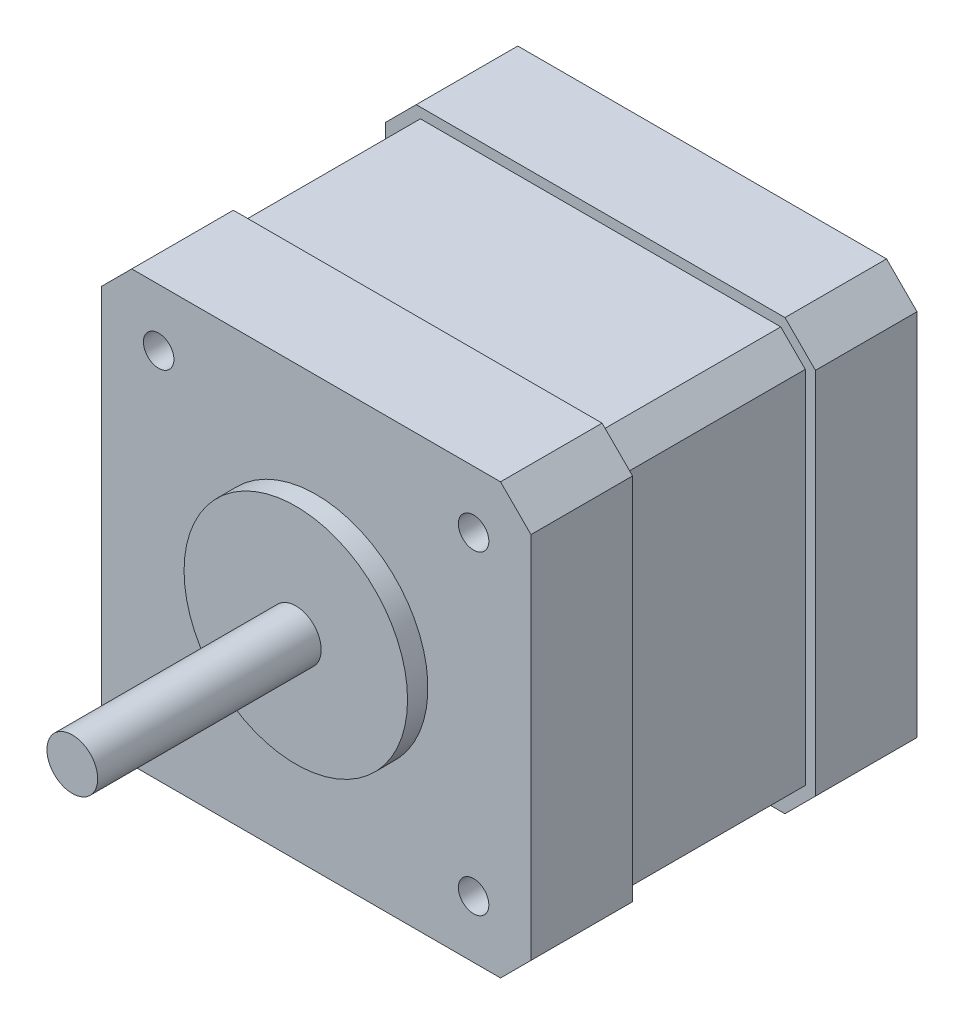
ISO-10303-21;
HEADER;
FILE_DESCRIPTION(('STEP AP214'),'2;1');
FILE_NAME('part.step','',(''),(''),'','','');
FILE_SCHEMA(('AUTOMOTIVE_DESIGN { 1 0 10303 214 1 1 1 1 }'));
ENDSEC;
DATA;
#1=APPLICATION_CONTEXT('core data for automotive mechanical design processes');
#2=APPLICATION_PROTOCOL_DEFINITION('international standard','automotive_design',2000,#1);
#3=PRODUCT_CONTEXT('',#1,'mechanical');
#4=PRODUCT('Part','Part','',(#3));
#5=PRODUCT_RELATED_PRODUCT_CATEGORY('part','',(#4));
#6=PRODUCT_DEFINITION_FORMATION('','',#4);
#7=PRODUCT_DEFINITION_CONTEXT('part definition',#1,'design');
#8=PRODUCT_DEFINITION('design','',#6,#7);
#9=PRODUCT_DEFINITION_SHAPE('','',#8);
#10=(LENGTH_UNIT() NAMED_UNIT(*) SI_UNIT(.MILLI.,.METRE.));
#11=(NAMED_UNIT(*) PLANE_ANGLE_UNIT() SI_UNIT($,.RADIAN.));
#12=(NAMED_UNIT(*) SI_UNIT($,.STERADIAN.) SOLID_ANGLE_UNIT());
#13=UNCERTAINTY_MEASURE_WITH_UNIT(LENGTH_MEASURE(1.E-05),#10,'distance_accuracy_value','');
#14=(GEOMETRIC_REPRESENTATION_CONTEXT(3) GLOBAL_UNCERTAINTY_ASSIGNED_CONTEXT((#13)) GLOBAL_UNIT_ASSIGNED_CONTEXT((#10,
#11,#12)) REPRESENTATION_CONTEXT('',''));
#15=CARTESIAN_POINT('',(0.,0.,0.));
#16=DIRECTION('',(0.,0.,1.));
#17=DIRECTION('',(1.,0.,0.));
#18=AXIS2_PLACEMENT_3D('',#15,#16,#17);
#19=CARTESIAN_POINT('',(0.,0.,0.));
#20=DIRECTION('',(0.,0.,-1.));
#21=DIRECTION('',(-1.,0.,0.));
#22=AXIS2_PLACEMENT_3D('',#19,#20,#21);
#23=PLANE('',#22);
#24=DIRECTION('',(-0.707106781186548,-0.707106781186548,0.));
#25=VECTOR('',#24,1.);
#26=CARTESIAN_POINT('',(-32.7677538051841,19.7638051044083,0.));
#27=LINE('',#26,#25);
#28=CARTESIAN_POINT('',(-29.7677538051841,22.7638051044083,0.));
#29=VERTEX_POINT('',#28);
#30=CARTESIAN_POINT('',(-32.7677538051841,19.7638051044083,0.));
#31=VERTEX_POINT('',#30);
#32=EDGE_CURVE('E158',#29,#31,#27,.T.);
#33=ORIENTED_EDGE('',*,*,#32,.F.);
#34=DIRECTION('',(-1.,0.,0.));
#35=VECTOR('',#34,1.);
#36=CARTESIAN_POINT('',(-29.7677538051841,22.7638051044083,0.));
#37=LINE('',#36,#35);
#38=CARTESIAN_POINT('',(6.53224619481587,22.7638051044083,0.));
#39=VERTEX_POINT('',#38);
#40=EDGE_CURVE('E98',#39,#29,#37,.T.);
#41=ORIENTED_EDGE('',*,*,#40,.F.);
#42=DIRECTION('',(-0.707106781186548,0.707106781186547,0.));
#43=VECTOR('',#42,1.);
#44=CARTESIAN_POINT('',(6.53224619481587,22.7638051044083,0.));
#45=LINE('',#44,#43);
#46=CARTESIAN_POINT('',(9.53224619481587,19.7638051044083,0.));
#47=VERTEX_POINT('',#46);
#48=EDGE_CURVE('E177',#47,#39,#45,.T.);
#49=ORIENTED_EDGE('',*,*,#48,.F.);
#50=DIRECTION('',(0.,1.,0.));
#51=VECTOR('',#50,1.);
#52=CARTESIAN_POINT('',(9.53224619481587,19.7638051044083,0.));
#53=LINE('',#52,#51);
#54=CARTESIAN_POINT('',(9.53224619481587,-16.5361948955916,0.));
#55=VERTEX_POINT('',#54);
#56=EDGE_CURVE('E141',#55,#47,#53,.T.);
#57=ORIENTED_EDGE('',*,*,#56,.F.);
#58=DIRECTION('',(0.707106781186548,0.707106781186547,0.));
#59=VECTOR('',#58,1.);
#60=CARTESIAN_POINT('',(9.53224619481587,-16.5361948955916,0.));
#61=LINE('',#60,#59);
#62=CARTESIAN_POINT('',(6.53224619481587,-19.5361948955916,0.));
#63=VERTEX_POINT('',#62);
#64=EDGE_CURVE('E172',#63,#55,#61,.T.);
#65=ORIENTED_EDGE('',*,*,#64,.F.);
#66=DIRECTION('',(1.,0.,0.));
#67=VECTOR('',#66,1.);
#68=CARTESIAN_POINT('',(6.53224619481587,-19.5361948955916,0.));
#69=LINE('',#68,#67);
#70=CARTESIAN_POINT('',(-29.7677538051841,-19.5361948955916,0.));
#71=VERTEX_POINT('',#70);
#72=EDGE_CURVE('E169',#71,#63,#69,.T.);
#73=ORIENTED_EDGE('',*,*,#72,.F.);
#74=DIRECTION('',(0.707106781186548,-0.707106781186548,0.));
#75=VECTOR('',#74,1.);
#76=CARTESIAN_POINT('',(-29.7677538051841,-19.5361948955916,0.));
#77=LINE('',#76,#75);
#78=CARTESIAN_POINT('',(-32.7677538051841,-16.5361948955916,0.));
#79=VERTEX_POINT('',#78);
#80=EDGE_CURVE('E166',#79,#71,#77,.T.);
#81=ORIENTED_EDGE('',*,*,#80,.F.);
#82=DIRECTION('',(0.,-1.,0.));
#83=VECTOR('',#82,1.);
#84=CARTESIAN_POINT('',(-32.7677538051841,-16.5361948955916,0.));
#85=LINE('',#84,#83);
#86=EDGE_CURVE('E162',#31,#79,#85,.T.);
#87=ORIENTED_EDGE('',*,*,#86,.F.);
#88=EDGE_LOOP('',(#33,#41,#49,#57,#65,#73,#81,#87));
#89=FACE_BOUND('',#88,.T.);
#90=DIRECTION('',(0.707106781186548,-0.707106781186547,0.));
#91=VECTOR('',#90,1.);
#92=CARTESIAN_POINT('',(8.53224619481587,19.3495915420353,0.));
#93=LINE('',#92,#91);
#94=CARTESIAN_POINT('',(6.11803263244278,21.7638051044083,0.));
#95=VERTEX_POINT('',#94);
#96=CARTESIAN_POINT('',(8.53224619481587,19.3495915420353,0.));
#97=VERTEX_POINT('',#96);
#98=EDGE_CURVE('E369',#95,#97,#93,.T.);
#99=ORIENTED_EDGE('',*,*,#98,.F.);
#100=DIRECTION('',(1.,0.,0.));
#101=VECTOR('',#100,1.);
#102=CARTESIAN_POINT('',(-11.6177538051841,21.7638051044083,0.));
#103=LINE('',#102,#101);
#104=CARTESIAN_POINT('',(-29.353540242811,21.7638051044083,0.));
#105=VERTEX_POINT('',#104);
#106=EDGE_CURVE('E305',#105,#95,#103,.T.);
#107=ORIENTED_EDGE('',*,*,#106,.F.);
#108=DIRECTION('',(0.707106781186547,0.707106781186547,0.));
#109=VECTOR('',#108,1.);
#110=CARTESIAN_POINT('',(-29.353540242811,21.7638051044083,0.));
#111=LINE('',#110,#109);
#112=CARTESIAN_POINT('',(-31.7677538051841,19.3495915420352,0.));
#113=VERTEX_POINT('',#112);
#114=EDGE_CURVE('E337',#113,#105,#111,.T.);
#115=ORIENTED_EDGE('',*,*,#114,.F.);
#116=DIRECTION('',(0.,1.,0.));
#117=VECTOR('',#116,1.);
#118=CARTESIAN_POINT('',(-31.7677538051841,-16.1219813332185,0.));
#119=LINE('',#118,#117);
#120=CARTESIAN_POINT('',(-31.7677538051841,-16.1219813332185,0.));
#121=VERTEX_POINT('',#120);
#122=EDGE_CURVE('E389',#121,#113,#119,.T.);
#123=ORIENTED_EDGE('',*,*,#122,.F.);
#124=DIRECTION('',(-0.707106781186549,0.707106781186547,0.));
#125=VECTOR('',#124,1.);
#126=CARTESIAN_POINT('',(-29.353540242811,-18.5361948955917,0.));
#127=LINE('',#126,#125);
#128=CARTESIAN_POINT('',(-29.353540242811,-18.5361948955917,0.));
#129=VERTEX_POINT('',#128);
#130=EDGE_CURVE('E385',#129,#121,#127,.T.);
#131=ORIENTED_EDGE('',*,*,#130,.F.);
#132=DIRECTION('',(-1.,0.,0.));
#133=VECTOR('',#132,1.);
#134=CARTESIAN_POINT('',(6.11803263244278,-18.5361948955916,0.));
#135=LINE('',#134,#133);
#136=CARTESIAN_POINT('',(6.11803263244278,-18.5361948955916,0.));
#137=VERTEX_POINT('',#136);
#138=EDGE_CURVE('E381',#137,#129,#135,.T.);
#139=ORIENTED_EDGE('',*,*,#138,.F.);
#140=DIRECTION('',(-0.707106781186547,-0.707106781186547,0.));
#141=VECTOR('',#140,1.);
#142=CARTESIAN_POINT('',(8.53224619481587,-16.1219813332186,0.));
#143=LINE('',#142,#141);
#144=CARTESIAN_POINT('',(8.53224619481587,-16.1219813332186,0.));
#145=VERTEX_POINT('',#144);
#146=EDGE_CURVE('E377',#145,#137,#143,.T.);
#147=ORIENTED_EDGE('',*,*,#146,.F.);
#148=DIRECTION('',(0.,-1.,0.));
#149=VECTOR('',#148,1.);
#150=CARTESIAN_POINT('',(8.53224619481587,19.3495915420353,0.));
#151=LINE('',#150,#149);
#152=EDGE_CURVE('E373',#97,#145,#151,.T.);
#153=ORIENTED_EDGE('',*,*,#152,.F.);
#154=EDGE_LOOP('',(#99,#107,#115,#123,#131,#139,#147,#153));
#155=FACE_BOUND('',#154,.T.);
#156=ADVANCED_FACE('F38',(#89,#155),#23,.T.);
#157=CARTESIAN_POINT('',(-11.6177538051841,1.61380510440835,12.));
#158=DIRECTION('',(0.,0.,1.));
#159=DIRECTION('',(1.,0.,0.));
#160=AXIS2_PLACEMENT_3D('',#157,#158,#159);
#161=PLANE('',#160);
#162=CARTESIAN_POINT('',(-11.6177538051841,1.61380510440835,12.));
#163=DIRECTION('',(0.,0.,1.));
#164=DIRECTION('',(1.,0.,0.));
#165=AXIS2_PLACEMENT_3D('',#162,#163,#164);
#166=CIRCLE('',#165,11.);
#167=CARTESIAN_POINT('',(-0.617753805184125,1.61380510440835,12.));
#168=VERTEX_POINT('',#167);
#169=EDGE_CURVE('E163',#168,#168,#166,.T.);
#170=ORIENTED_EDGE('',*,*,#169,.T.);
#171=EDGE_LOOP('',(#170));
#172=FACE_BOUND('',#171,.T.);
#173=CARTESIAN_POINT('',(-11.6177538051841,1.61380510440835,12.));
#174=DIRECTION('',(0.,0.,1.));
#175=DIRECTION('',(1.,0.,0.));
#176=AXIS2_PLACEMENT_3D('',#173,#174,#175);
#177=CIRCLE('',#176,2.5);
#178=CARTESIAN_POINT('',(-9.11775380518413,1.61380510440835,12.));
#179=VERTEX_POINT('',#178);
#180=EDGE_CURVE('E423',#179,#179,#177,.T.);
#181=ORIENTED_EDGE('',*,*,#180,.F.);
#182=EDGE_LOOP('',(#181));
#183=FACE_BOUND('',#182,.T.);
#184=ADVANCED_FACE('F600',(#172,#183),#161,.T.);
#185=CARTESIAN_POINT('',(0.,0.,10.));
#186=DIRECTION('',(0.,0.,-1.));
#187=DIRECTION('',(-1.,0.,0.));
#188=AXIS2_PLACEMENT_3D('',#185,#186,#187);
#189=PLANE('',#188);
#190=CARTESIAN_POINT('',(-27.1177538051841,-13.8861948955917,10.));
#191=DIRECTION('',(0.,0.,1.));
#192=DIRECTION('',(1.,0.,0.));
#193=AXIS2_PLACEMENT_3D('',#190,#191,#192);
#194=CIRCLE('',#193,1.5);
#195=CARTESIAN_POINT('',(-25.6177538051841,-13.8861948955917,10.));
#196=VERTEX_POINT('',#195);
#197=EDGE_CURVE('E232',#196,#196,#194,.T.);
#198=ORIENTED_EDGE('',*,*,#197,.F.);
#199=EDGE_LOOP('',(#198));
#200=FACE_BOUND('',#199,.T.);
#201=CARTESIAN_POINT('',(3.88224619481587,-13.8861948955917,10.));
#202=DIRECTION('',(0.,0.,1.));
#203=DIRECTION('',(1.,0.,0.));
#204=AXIS2_PLACEMENT_3D('',#201,#202,#203);
#205=CIRCLE('',#204,1.5);
#206=CARTESIAN_POINT('',(5.38224619481587,-13.8861948955917,10.));
#207=VERTEX_POINT('',#206);
#208=EDGE_CURVE('E216',#207,#207,#205,.T.);
#209=ORIENTED_EDGE('',*,*,#208,.F.);
#210=EDGE_LOOP('',(#209));
#211=FACE_BOUND('',#210,.T.);
#212=CARTESIAN_POINT('',(3.88224619481587,17.1138051044083,10.));
#213=DIRECTION('',(0.,0.,1.));
#214=DIRECTION('',(1.,0.,0.));
#215=AXIS2_PLACEMENT_3D('',#212,#213,#214);
#216=CIRCLE('',#215,1.5);
#217=CARTESIAN_POINT('',(5.38224619481587,17.1138051044083,10.));
#218=VERTEX_POINT('',#217);
#219=EDGE_CURVE('E212',#218,#218,#216,.T.);
#220=ORIENTED_EDGE('',*,*,#219,.F.);
#221=EDGE_LOOP('',(#220));
#222=FACE_BOUND('',#221,.T.);
#223=CARTESIAN_POINT('',(-27.1177538051841,17.1138051044083,10.));
#224=DIRECTION('',(0.,0.,1.));
#225=DIRECTION('',(1.,0.,0.));
#226=AXIS2_PLACEMENT_3D('',#223,#224,#225);
#227=CIRCLE('',#226,1.5);
#228=CARTESIAN_POINT('',(-25.6177538051841,17.1138051044083,10.));
#229=VERTEX_POINT('',#228);
#230=EDGE_CURVE('E208',#229,#229,#227,.T.);
#231=ORIENTED_EDGE('',*,*,#230,.F.);
#232=EDGE_LOOP('',(#231));
#233=FACE_BOUND('',#232,.T.);
#234=DIRECTION('',(-0.707106781186548,-0.707106781186548,0.));
#235=VECTOR('',#234,1.);
#236=CARTESIAN_POINT('',(-32.7677538051841,19.7638051044083,10.));
#237=LINE('',#236,#235);
#238=CARTESIAN_POINT('',(-29.7677538051841,22.7638051044083,10.));
#239=VERTEX_POINT('',#238);
#240=CARTESIAN_POINT('',(-32.7677538051841,19.7638051044083,10.));
#241=VERTEX_POINT('',#240);
#242=EDGE_CURVE('E182',#239,#241,#237,.T.);
#243=ORIENTED_EDGE('',*,*,#242,.T.);
#244=DIRECTION('',(0.,-1.,0.));
#245=VECTOR('',#244,1.);
#246=CARTESIAN_POINT('',(-32.7677538051841,-16.5361948955916,10.));
#247=LINE('',#246,#245);
#248=CARTESIAN_POINT('',(-32.7677538051841,-16.5361948955916,10.));
#249=VERTEX_POINT('',#248);
#250=EDGE_CURVE('E107',#241,#249,#247,.T.);
#251=ORIENTED_EDGE('',*,*,#250,.T.);
#252=DIRECTION('',(0.707106781186548,-0.707106781186548,0.));
#253=VECTOR('',#252,1.);
#254=CARTESIAN_POINT('',(-29.7677538051841,-19.5361948955916,10.));
#255=LINE('',#254,#253);
#256=CARTESIAN_POINT('',(-29.7677538051841,-19.5361948955916,10.));
#257=VERTEX_POINT('',#256);
#258=EDGE_CURVE('E437',#249,#257,#255,.T.);
#259=ORIENTED_EDGE('',*,*,#258,.T.);
#260=DIRECTION('',(1.,0.,0.));
#261=VECTOR('',#260,1.);
#262=CARTESIAN_POINT('',(6.53224619481587,-19.5361948955916,10.));
#263=LINE('',#262,#261);
#264=CARTESIAN_POINT('',(6.53224619481587,-19.5361948955916,10.));
#265=VERTEX_POINT('',#264);
#266=EDGE_CURVE('E440',#257,#265,#263,.T.);
#267=ORIENTED_EDGE('',*,*,#266,.T.);
#268=DIRECTION('',(0.707106781186548,0.707106781186547,0.));
#269=VECTOR('',#268,1.);
#270=CARTESIAN_POINT('',(9.53224619481587,-16.5361948955916,10.));
#271=LINE('',#270,#269);
#272=CARTESIAN_POINT('',(9.53224619481587,-16.5361948955916,10.));
#273=VERTEX_POINT('',#272);
#274=EDGE_CURVE('E131',#265,#273,#271,.T.);
#275=ORIENTED_EDGE('',*,*,#274,.T.);
#276=DIRECTION('',(0.,1.,0.));
#277=VECTOR('',#276,1.);
#278=CARTESIAN_POINT('',(9.53224619481587,19.7638051044083,10.));
#279=LINE('',#278,#277);
#280=CARTESIAN_POINT('',(9.53224619481587,19.7638051044083,10.));
#281=VERTEX_POINT('',#280);
#282=EDGE_CURVE('E123',#273,#281,#279,.T.);
#283=ORIENTED_EDGE('',*,*,#282,.T.);
#284=DIRECTION('',(-0.707106781186548,0.707106781186547,0.));
#285=VECTOR('',#284,1.);
#286=CARTESIAN_POINT('',(6.53224619481587,22.7638051044083,10.));
#287=LINE('',#286,#285);
#288=CARTESIAN_POINT('',(6.53224619481587,22.7638051044083,10.));
#289=VERTEX_POINT('',#288);
#290=EDGE_CURVE('E128',#281,#289,#287,.T.);
#291=ORIENTED_EDGE('',*,*,#290,.T.);
#292=DIRECTION('',(-1.,0.,0.));
#293=VECTOR('',#292,1.);
#294=CARTESIAN_POINT('',(-29.7677538051841,22.7638051044083,10.));
#295=LINE('',#294,#293);
#296=EDGE_CURVE('E65',#289,#239,#295,.T.);
#297=ORIENTED_EDGE('',*,*,#296,.T.);
#298=EDGE_LOOP('',(#243,#251,#259,#267,#275,#283,#291,#297));
#299=FACE_BOUND('',#298,.T.);
#300=CARTESIAN_POINT('',(-11.6177538051841,1.61380510440835,10.));
#301=DIRECTION('',(0.,0.,-1.));
#302=DIRECTION('',(-1.,0.,0.));
#303=AXIS2_PLACEMENT_3D('',#300,#301,#302);
#304=CIRCLE('',#303,11.);
#305=CARTESIAN_POINT('',(-22.6177538051841,1.61380510440835,10.));
#306=VERTEX_POINT('',#305);
#307=EDGE_CURVE('E11',#306,#306,#304,.F.);
#308=ORIENTED_EDGE('',*,*,#307,.F.);
#309=EDGE_LOOP('',(#308));
#310=FACE_BOUND('',#309,.T.);
#311=ADVANCED_FACE('F125',(#200,#211,#222,#233,#299,#310),#189,.F.);
#312=CARTESIAN_POINT('',(-32.7677538051841,19.7638051044083,10.));
#313=DIRECTION('',(0.707106781186548,-0.707106781186548,0.));
#314=DIRECTION('',(0.707106781186548,0.707106781186548,0.));
#315=AXIS2_PLACEMENT_3D('',#312,#313,#314);
#316=PLANE('',#315);
#317=ORIENTED_EDGE('',*,*,#32,.T.);
#318=DIRECTION('',(0.,0.,-1.));
#319=VECTOR('',#318,1.);
#320=CARTESIAN_POINT('',(-32.7677538051841,19.7638051044083,10.));
#321=LINE('',#320,#319);
#322=EDGE_CURVE('E48',#241,#31,#321,.T.);
#323=ORIENTED_EDGE('',*,*,#322,.F.);
#324=ORIENTED_EDGE('',*,*,#242,.F.);
#325=DIRECTION('',(0.,0.,-1.));
#326=VECTOR('',#325,1.);
#327=CARTESIAN_POINT('',(-29.7677538051841,22.7638051044083,10.));
#328=LINE('',#327,#326);
#329=EDGE_CURVE('E154',#239,#29,#328,.T.);
#330=ORIENTED_EDGE('',*,*,#329,.T.);
#331=EDGE_LOOP('',(#317,#323,#324,#330));
#332=FACE_BOUND('',#331,.T.);
#333=ADVANCED_FACE('F40',(#332),#316,.F.);
#334=CARTESIAN_POINT('',(-32.7677538051841,-16.5361948955916,10.));
#335=DIRECTION('',(1.,0.,0.));
#336=DIRECTION('',(0.,0.,-1.));
#337=AXIS2_PLACEMENT_3D('',#334,#335,#336);
#338=PLANE('',#337);
#339=ORIENTED_EDGE('',*,*,#86,.T.);
#340=DIRECTION('',(0.,0.,-1.));
#341=VECTOR('',#340,1.);
#342=CARTESIAN_POINT('',(-32.7677538051841,-16.5361948955916,10.));
#343=LINE('',#342,#341);
#344=EDGE_CURVE('E197',#249,#79,#343,.T.);
#345=ORIENTED_EDGE('',*,*,#344,.F.);
#346=ORIENTED_EDGE('',*,*,#250,.F.);
#347=ORIENTED_EDGE('',*,*,#322,.T.);
#348=EDGE_LOOP('',(#339,#345,#346,#347));
#349=FACE_BOUND('',#348,.T.);
#350=ADVANCED_FACE('F630',(#349),#338,.F.);
#351=CARTESIAN_POINT('',(-29.7677538051841,-19.5361948955916,10.));
#352=DIRECTION('',(0.707106781186548,0.707106781186548,0.));
#353=DIRECTION('',(-0.707106781186548,0.707106781186548,0.));
#354=AXIS2_PLACEMENT_3D('',#351,#352,#353);
#355=PLANE('',#354);
#356=ORIENTED_EDGE('',*,*,#80,.T.);
#357=DIRECTION('',(0.,0.,-1.));
#358=VECTOR('',#357,1.);
#359=CARTESIAN_POINT('',(-29.7677538051841,-19.5361948955916,10.));
#360=LINE('',#359,#358);
#361=EDGE_CURVE('E193',#257,#71,#360,.T.);
#362=ORIENTED_EDGE('',*,*,#361,.F.);
#363=ORIENTED_EDGE('',*,*,#258,.F.);
#364=ORIENTED_EDGE('',*,*,#344,.T.);
#365=EDGE_LOOP('',(#356,#362,#363,#364));
#366=FACE_BOUND('',#365,.T.);
#367=ADVANCED_FACE('F627',(#366),#355,.F.);
#368=CARTESIAN_POINT('',(6.53224619481587,-19.5361948955916,10.));
#369=DIRECTION('',(0.,1.,0.));
#370=DIRECTION('',(0.,0.,1.));
#371=AXIS2_PLACEMENT_3D('',#368,#369,#370);
#372=PLANE('',#371);
#373=ORIENTED_EDGE('',*,*,#72,.T.);
#374=DIRECTION('',(0.,0.,-1.));
#375=VECTOR('',#374,1.);
#376=CARTESIAN_POINT('',(6.53224619481587,-19.5361948955916,10.));
#377=LINE('',#376,#375);
#378=EDGE_CURVE('E189',#265,#63,#377,.T.);
#379=ORIENTED_EDGE('',*,*,#378,.F.);
#380=ORIENTED_EDGE('',*,*,#266,.F.);
#381=ORIENTED_EDGE('',*,*,#361,.T.);
#382=EDGE_LOOP('',(#373,#379,#380,#381));
#383=FACE_BOUND('',#382,.T.);
#384=ADVANCED_FACE('F623',(#383),#372,.F.);
#385=CARTESIAN_POINT('',(9.53224619481587,-16.5361948955916,10.));
#386=DIRECTION('',(-0.707106781186547,0.707106781186548,0.));
#387=DIRECTION('',(-0.707106781186548,-0.707106781186547,0.));
#388=AXIS2_PLACEMENT_3D('',#385,#386,#387);
#389=PLANE('',#388);
#390=ORIENTED_EDGE('',*,*,#64,.T.);
#391=DIRECTION('',(0.,0.,-1.));
#392=VECTOR('',#391,1.);
#393=CARTESIAN_POINT('',(9.53224619481587,-16.5361948955916,10.));
#394=LINE('',#393,#392);
#395=EDGE_CURVE('E145',#273,#55,#394,.T.);
#396=ORIENTED_EDGE('',*,*,#395,.F.);
#397=ORIENTED_EDGE('',*,*,#274,.F.);
#398=ORIENTED_EDGE('',*,*,#378,.T.);
#399=EDGE_LOOP('',(#390,#396,#397,#398));
#400=FACE_BOUND('',#399,.T.);
#401=ADVANCED_FACE('F620',(#400),#389,.F.);
#402=CARTESIAN_POINT('',(9.53224619481587,19.7638051044083,10.));
#403=DIRECTION('',(-1.,0.,0.));
#404=DIRECTION('',(0.,0.,1.));
#405=AXIS2_PLACEMENT_3D('',#402,#403,#404);
#406=PLANE('',#405);
#407=ORIENTED_EDGE('',*,*,#56,.T.);
#408=DIRECTION('',(0.,0.,-1.));
#409=VECTOR('',#408,1.);
#410=CARTESIAN_POINT('',(9.53224619481587,19.7638051044083,10.));
#411=LINE('',#410,#409);
#412=EDGE_CURVE('E138',#281,#47,#411,.T.);
#413=ORIENTED_EDGE('',*,*,#412,.F.);
#414=ORIENTED_EDGE('',*,*,#282,.F.);
#415=ORIENTED_EDGE('',*,*,#395,.T.);
#416=EDGE_LOOP('',(#407,#413,#414,#415));
#417=FACE_BOUND('',#416,.T.);
#418=ADVANCED_FACE('F139',(#417),#406,.F.);
#419=CARTESIAN_POINT('',(6.53224619481587,22.7638051044083,10.));
#420=DIRECTION('',(-0.707106781186547,-0.707106781186548,0.));
#421=DIRECTION('',(0.707106781186548,-0.707106781186547,0.));
#422=AXIS2_PLACEMENT_3D('',#419,#420,#421);
#423=PLANE('',#422);
#424=ORIENTED_EDGE('',*,*,#48,.T.);
#425=DIRECTION('',(0.,0.,-1.));
#426=VECTOR('',#425,1.);
#427=CARTESIAN_POINT('',(6.53224619481587,22.7638051044083,10.));
#428=LINE('',#427,#426);
#429=EDGE_CURVE('E146',#289,#39,#428,.T.);
#430=ORIENTED_EDGE('',*,*,#429,.F.);
#431=ORIENTED_EDGE('',*,*,#290,.F.);
#432=ORIENTED_EDGE('',*,*,#412,.T.);
#433=EDGE_LOOP('',(#424,#430,#431,#432));
#434=FACE_BOUND('',#433,.T.);
#435=ADVANCED_FACE('F148',(#434),#423,.F.);
#436=CARTESIAN_POINT('',(-29.7677538051841,22.7638051044083,10.));
#437=DIRECTION('',(0.,-1.,0.));
#438=DIRECTION('',(0.,0.,-1.));
#439=AXIS2_PLACEMENT_3D('',#436,#437,#438);
#440=PLANE('',#439);
#441=ORIENTED_EDGE('',*,*,#40,.T.);
#442=ORIENTED_EDGE('',*,*,#329,.F.);
#443=ORIENTED_EDGE('',*,*,#296,.F.);
#444=ORIENTED_EDGE('',*,*,#429,.T.);
#445=EDGE_LOOP('',(#441,#442,#443,#444));
#446=FACE_BOUND('',#445,.T.);
#447=ADVANCED_FACE('F612',(#446),#440,.F.);
#448=CARTESIAN_POINT('',(-11.6177538051841,1.61380510440835,12.));
#449=DIRECTION('',(0.,0.,-1.));
#450=DIRECTION('',(-1.,0.,0.));
#451=AXIS2_PLACEMENT_3D('',#448,#449,#450);
#452=CYLINDRICAL_SURFACE('',#451,11.);
#453=ORIENTED_EDGE('',*,*,#169,.F.);
#454=EDGE_LOOP('',(#453));
#455=FACE_BOUND('',#454,.T.);
#456=ORIENTED_EDGE('',*,*,#307,.T.);
#457=EDGE_LOOP('',(#456));
#458=FACE_BOUND('',#457,.T.);
#459=ADVANCED_FACE('F615',(#455,#458),#452,.T.);
#460=CARTESIAN_POINT('',(-11.6177538051841,1.61380510440835,34.));
#461=DIRECTION('',(0.,0.,-1.));
#462=DIRECTION('',(-1.,0.,0.));
#463=AXIS2_PLACEMENT_3D('',#460,#461,#462);
#464=CYLINDRICAL_SURFACE('',#463,2.5);
#465=CARTESIAN_POINT('',(-11.6177538051841,1.61380510440835,34.));
#466=DIRECTION('',(0.,0.,1.));
#467=DIRECTION('',(1.,0.,0.));
#468=AXIS2_PLACEMENT_3D('',#465,#466,#467);
#469=CIRCLE('',#468,2.5);
#470=CARTESIAN_POINT('',(-9.11775380518413,1.61380510440835,34.));
#471=VERTEX_POINT('',#470);
#472=EDGE_CURVE('E424',#471,#471,#469,.T.);
#473=ORIENTED_EDGE('',*,*,#472,.F.);
#474=EDGE_LOOP('',(#473));
#475=FACE_BOUND('',#474,.T.);
#476=ORIENTED_EDGE('',*,*,#180,.T.);
#477=EDGE_LOOP('',(#476));
#478=FACE_BOUND('',#477,.T.);
#479=ADVANCED_FACE('F903',(#475,#478),#464,.T.);
#480=CARTESIAN_POINT('',(-11.6177538051841,1.61380510440835,34.));
#481=DIRECTION('',(0.,0.,1.));
#482=DIRECTION('',(1.,0.,0.));
#483=AXIS2_PLACEMENT_3D('',#480,#481,#482);
#484=PLANE('',#483);
#485=ORIENTED_EDGE('',*,*,#472,.T.);
#486=EDGE_LOOP('',(#485));
#487=FACE_BOUND('',#486,.T.);
#488=ADVANCED_FACE('F873',(#487),#484,.T.);
#489=CARTESIAN_POINT('',(-11.6177538051841,21.7638051044083,-18.));
#490=DIRECTION('',(0.,-1.,0.));
#491=DIRECTION('',(0.,0.,-1.));
#492=AXIS2_PLACEMENT_3D('',#489,#490,#491);
#493=PLANE('',#492);
#494=ORIENTED_EDGE('',*,*,#106,.T.);
#495=DIRECTION('',(0.,0.,1.));
#496=VECTOR('',#495,1.);
#497=CARTESIAN_POINT('',(6.11803263244278,21.7638051044083,-18.));
#498=LINE('',#497,#496);
#499=CARTESIAN_POINT('',(6.11803263244278,21.7638051044083,-18.));
#500=VERTEX_POINT('',#499);
#501=EDGE_CURVE('E419',#500,#95,#498,.T.);
#502=ORIENTED_EDGE('',*,*,#501,.F.);
#503=DIRECTION('',(1.,0.,0.));
#504=VECTOR('',#503,1.);
#505=CARTESIAN_POINT('',(-11.6177538051841,21.7638051044083,-18.));
#506=LINE('',#505,#504);
#507=CARTESIAN_POINT('',(-29.353540242811,21.7638051044083,-18.));
#508=VERTEX_POINT('',#507);
#509=EDGE_CURVE('E332',#508,#500,#506,.T.);
#510=ORIENTED_EDGE('',*,*,#509,.F.);
#511=DIRECTION('',(0.,0.,1.));
#512=VECTOR('',#511,1.);
#513=CARTESIAN_POINT('',(-29.353540242811,21.7638051044083,-18.));
#514=LINE('',#513,#512);
#515=EDGE_CURVE('E365',#508,#105,#514,.T.);
#516=ORIENTED_EDGE('',*,*,#515,.T.);
#517=EDGE_LOOP('',(#494,#502,#510,#516));
#518=FACE_BOUND('',#517,.T.);
#519=ADVANCED_FACE('F567',(#518),#493,.F.);
#520=CARTESIAN_POINT('',(8.53224619481587,19.3495915420353,-18.));
#521=DIRECTION('',(-0.707106781186547,-0.707106781186548,0.));
#522=DIRECTION('',(0.707106781186548,-0.707106781186547,0.));
#523=AXIS2_PLACEMENT_3D('',#520,#521,#522);
#524=PLANE('',#523);
#525=ORIENTED_EDGE('',*,*,#98,.T.);
#526=DIRECTION('',(0.,0.,1.));
#527=VECTOR('',#526,1.);
#528=CARTESIAN_POINT('',(8.53224619481587,19.3495915420353,-18.));
#529=LINE('',#528,#527);
#530=CARTESIAN_POINT('',(8.53224619481587,19.3495915420353,-18.));
#531=VERTEX_POINT('',#530);
#532=EDGE_CURVE('E415',#531,#97,#529,.T.);
#533=ORIENTED_EDGE('',*,*,#532,.F.);
#534=DIRECTION('',(0.707106781186548,-0.707106781186547,0.));
#535=VECTOR('',#534,1.);
#536=CARTESIAN_POINT('',(8.53224619481587,19.3495915420353,-18.));
#537=LINE('',#536,#535);
#538=EDGE_CURVE('E336',#500,#531,#537,.T.);
#539=ORIENTED_EDGE('',*,*,#538,.F.);
#540=ORIENTED_EDGE('',*,*,#501,.T.);
#541=EDGE_LOOP('',(#525,#533,#539,#540));
#542=FACE_BOUND('',#541,.T.);
#543=ADVANCED_FACE('F572',(#542),#524,.F.);
#544=CARTESIAN_POINT('',(8.53224619481587,19.3495915420353,-18.));
#545=DIRECTION('',(-1.,0.,0.));
#546=DIRECTION('',(0.,0.,1.));
#547=AXIS2_PLACEMENT_3D('',#544,#545,#546);
#548=PLANE('',#547);
#549=ORIENTED_EDGE('',*,*,#152,.T.);
#550=DIRECTION('',(0.,0.,1.));
#551=VECTOR('',#550,1.);
#552=CARTESIAN_POINT('',(8.53224619481587,-16.1219813332186,-18.));
#553=LINE('',#552,#551);
#554=CARTESIAN_POINT('',(8.53224619481587,-16.1219813332186,-18.));
#555=VERTEX_POINT('',#554);
#556=EDGE_CURVE('E411',#555,#145,#553,.T.);
#557=ORIENTED_EDGE('',*,*,#556,.F.);
#558=DIRECTION('',(0.,-1.,0.));
#559=VECTOR('',#558,1.);
#560=CARTESIAN_POINT('',(8.53224619481587,19.3495915420353,-18.));
#561=LINE('',#560,#559);
#562=EDGE_CURVE('E341',#531,#555,#561,.T.);
#563=ORIENTED_EDGE('',*,*,#562,.F.);
#564=ORIENTED_EDGE('',*,*,#532,.T.);
#565=EDGE_LOOP('',(#549,#557,#563,#564));
#566=FACE_BOUND('',#565,.T.);
#567=ADVANCED_FACE('F576',(#566),#548,.F.);
#568=CARTESIAN_POINT('',(8.53224619481587,-16.1219813332186,-18.));
#569=DIRECTION('',(-0.707106781186547,0.707106781186547,0.));
#570=DIRECTION('',(-0.707106781186548,-0.707106781186548,0.));
#571=AXIS2_PLACEMENT_3D('',#568,#569,#570);
#572=PLANE('',#571);
#573=ORIENTED_EDGE('',*,*,#146,.T.);
#574=DIRECTION('',(0.,0.,1.));
#575=VECTOR('',#574,1.);
#576=CARTESIAN_POINT('',(6.11803263244278,-18.5361948955916,-18.));
#577=LINE('',#576,#575);
#578=CARTESIAN_POINT('',(6.11803263244278,-18.5361948955916,-18.));
#579=VERTEX_POINT('',#578);
#580=EDGE_CURVE('E407',#579,#137,#577,.T.);
#581=ORIENTED_EDGE('',*,*,#580,.F.);
#582=DIRECTION('',(-0.707106781186547,-0.707106781186547,0.));
#583=VECTOR('',#582,1.);
#584=CARTESIAN_POINT('',(8.53224619481587,-16.1219813332186,-18.));
#585=LINE('',#584,#583);
#586=EDGE_CURVE('E345',#555,#579,#585,.T.);
#587=ORIENTED_EDGE('',*,*,#586,.F.);
#588=ORIENTED_EDGE('',*,*,#556,.T.);
#589=EDGE_LOOP('',(#573,#581,#587,#588));
#590=FACE_BOUND('',#589,.T.);
#591=ADVANCED_FACE('F590',(#590),#572,.F.);
#592=CARTESIAN_POINT('',(6.11803263244278,-18.5361948955916,-18.));
#593=DIRECTION('',(0.,1.,0.));
#594=DIRECTION('',(-1.,0.,0.));
#595=AXIS2_PLACEMENT_3D('',#592,#593,#594);
#596=PLANE('',#595);
#597=ORIENTED_EDGE('',*,*,#138,.T.);
#598=DIRECTION('',(0.,0.,1.));
#599=VECTOR('',#598,1.);
#600=CARTESIAN_POINT('',(-29.353540242811,-18.5361948955917,-18.));
#601=LINE('',#600,#599);
#602=CARTESIAN_POINT('',(-29.353540242811,-18.5361948955917,-18.));
#603=VERTEX_POINT('',#602);
#604=EDGE_CURVE('E403',#603,#129,#601,.T.);
#605=ORIENTED_EDGE('',*,*,#604,.F.);
#606=DIRECTION('',(-1.,0.,0.));
#607=VECTOR('',#606,1.);
#608=CARTESIAN_POINT('',(6.11803263244278,-18.5361948955916,-18.));
#609=LINE('',#608,#607);
#610=EDGE_CURVE('E349',#579,#603,#609,.T.);
#611=ORIENTED_EDGE('',*,*,#610,.F.);
#612=ORIENTED_EDGE('',*,*,#580,.T.);
#613=EDGE_LOOP('',(#597,#605,#611,#612));
#614=FACE_BOUND('',#613,.T.);
#615=ADVANCED_FACE('F586',(#614),#596,.F.);
#616=CARTESIAN_POINT('',(-29.353540242811,-18.5361948955917,-18.));
#617=DIRECTION('',(0.707106781186547,0.707106781186548,0.));
#618=DIRECTION('',(-0.707106781186548,0.707106781186547,0.));
#619=AXIS2_PLACEMENT_3D('',#616,#617,#618);
#620=PLANE('',#619);
#621=ORIENTED_EDGE('',*,*,#130,.T.);
#622=DIRECTION('',(0.,0.,1.));
#623=VECTOR('',#622,1.);
#624=CARTESIAN_POINT('',(-31.7677538051841,-16.1219813332185,-18.));
#625=LINE('',#624,#623);
#626=CARTESIAN_POINT('',(-31.7677538051841,-16.1219813332185,-18.));
#627=VERTEX_POINT('',#626);
#628=EDGE_CURVE('E399',#627,#121,#625,.T.);
#629=ORIENTED_EDGE('',*,*,#628,.F.);
#630=DIRECTION('',(-0.707106781186549,0.707106781186547,0.));
#631=VECTOR('',#630,1.);
#632=CARTESIAN_POINT('',(-29.353540242811,-18.5361948955917,-18.));
#633=LINE('',#632,#631);
#634=EDGE_CURVE('E353',#603,#627,#633,.T.);
#635=ORIENTED_EDGE('',*,*,#634,.F.);
#636=ORIENTED_EDGE('',*,*,#604,.T.);
#637=EDGE_LOOP('',(#621,#629,#635,#636));
#638=FACE_BOUND('',#637,.T.);
#639=ADVANCED_FACE('F588',(#638),#620,.F.);
#640=CARTESIAN_POINT('',(-31.7677538051841,-16.1219813332185,-18.));
#641=DIRECTION('',(1.,0.,0.));
#642=DIRECTION('',(0.,0.,-1.));
#643=AXIS2_PLACEMENT_3D('',#640,#641,#642);
#644=PLANE('',#643);
#645=ORIENTED_EDGE('',*,*,#122,.T.);
#646=DIRECTION('',(0.,0.,1.));
#647=VECTOR('',#646,1.);
#648=CARTESIAN_POINT('',(-31.7677538051841,19.3495915420352,-18.));
#649=LINE('',#648,#647);
#650=CARTESIAN_POINT('',(-31.7677538051841,19.3495915420352,-18.));
#651=VERTEX_POINT('',#650);
#652=EDGE_CURVE('E56',#651,#113,#649,.T.);
#653=ORIENTED_EDGE('',*,*,#652,.F.);
#654=DIRECTION('',(0.,1.,0.));
#655=VECTOR('',#654,1.);
#656=CARTESIAN_POINT('',(-31.7677538051841,-16.1219813332185,-18.));
#657=LINE('',#656,#655);
#658=EDGE_CURVE('E357',#627,#651,#657,.T.);
#659=ORIENTED_EDGE('',*,*,#658,.F.);
#660=ORIENTED_EDGE('',*,*,#628,.T.);
#661=EDGE_LOOP('',(#645,#653,#659,#660));
#662=FACE_BOUND('',#661,.T.);
#663=ADVANCED_FACE('F583',(#662),#644,.F.);
#664=CARTESIAN_POINT('',(-29.353540242811,21.7638051044083,-18.));
#665=DIRECTION('',(0.707106781186547,-0.707106781186547,0.));
#666=DIRECTION('',(0.707106781186548,0.707106781186548,0.));
#667=AXIS2_PLACEMENT_3D('',#664,#665,#666);
#668=PLANE('',#667);
#669=ORIENTED_EDGE('',*,*,#114,.T.);
#670=ORIENTED_EDGE('',*,*,#515,.F.);
#671=DIRECTION('',(0.707106781186547,0.707106781186547,0.));
#672=VECTOR('',#671,1.);
#673=CARTESIAN_POINT('',(-29.353540242811,21.7638051044083,-18.));
#674=LINE('',#673,#672);
#675=EDGE_CURVE('E361',#651,#508,#674,.T.);
#676=ORIENTED_EDGE('',*,*,#675,.F.);
#677=ORIENTED_EDGE('',*,*,#652,.T.);
#678=EDGE_LOOP('',(#669,#670,#676,#677));
#679=FACE_BOUND('',#678,.T.);
#680=ADVANCED_FACE('F562',(#679),#668,.F.);
#681=CARTESIAN_POINT('',(0.,0.,-18.));
#682=DIRECTION('',(0.,0.,-1.));
#683=DIRECTION('',(-1.,0.,0.));
#684=AXIS2_PLACEMENT_3D('',#681,#682,#683);
#685=PLANE('',#684);
#686=DIRECTION('',(-0.707106781186548,-0.707106781186548,0.));
#687=VECTOR('',#686,1.);
#688=CARTESIAN_POINT('',(-32.7677538051841,19.7638051044083,-18.));
#689=LINE('',#688,#687);
#690=CARTESIAN_POINT('',(-29.7677538051841,22.7638051044083,-18.));
#691=VERTEX_POINT('',#690);
#692=CARTESIAN_POINT('',(-32.7677538051841,19.7638051044083,-18.));
#693=VERTEX_POINT('',#692);
#694=EDGE_CURVE('E207',#691,#693,#689,.T.);
#695=ORIENTED_EDGE('',*,*,#694,.T.);
#696=DIRECTION('',(0.,-1.,0.));
#697=VECTOR('',#696,1.);
#698=CARTESIAN_POINT('',(-32.7677538051841,-16.5361948955916,-18.));
#699=LINE('',#698,#697);
#700=CARTESIAN_POINT('',(-32.7677538051841,-16.5361948955916,-18.));
#701=VERTEX_POINT('',#700);
#702=EDGE_CURVE('E274',#693,#701,#699,.T.);
#703=ORIENTED_EDGE('',*,*,#702,.T.);
#704=DIRECTION('',(0.707106781186548,-0.707106781186548,0.));
#705=VECTOR('',#704,1.);
#706=CARTESIAN_POINT('',(-29.7677538051841,-19.5361948955916,-18.));
#707=LINE('',#706,#705);
#708=CARTESIAN_POINT('',(-29.7677538051841,-19.5361948955916,-18.));
#709=VERTEX_POINT('',#708);
#710=EDGE_CURVE('E278',#701,#709,#707,.T.);
#711=ORIENTED_EDGE('',*,*,#710,.T.);
#712=DIRECTION('',(1.,0.,0.));
#713=VECTOR('',#712,1.);
#714=CARTESIAN_POINT('',(6.53224619481587,-19.5361948955916,-18.));
#715=LINE('',#714,#713);
#716=CARTESIAN_POINT('',(6.53224619481587,-19.5361948955916,-18.));
#717=VERTEX_POINT('',#716);
#718=EDGE_CURVE('E282',#709,#717,#715,.T.);
#719=ORIENTED_EDGE('',*,*,#718,.T.);
#720=DIRECTION('',(0.707106781186548,0.707106781186547,0.));
#721=VECTOR('',#720,1.);
#722=CARTESIAN_POINT('',(9.53224619481587,-16.5361948955916,-18.));
#723=LINE('',#722,#721);
#724=CARTESIAN_POINT('',(9.53224619481587,-16.5361948955916,-18.));
#725=VERTEX_POINT('',#724);
#726=EDGE_CURVE('E286',#717,#725,#723,.T.);
#727=ORIENTED_EDGE('',*,*,#726,.T.);
#728=DIRECTION('',(0.,1.,0.));
#729=VECTOR('',#728,1.);
#730=CARTESIAN_POINT('',(9.53224619481587,19.7638051044083,-18.));
#731=LINE('',#730,#729);
#732=CARTESIAN_POINT('',(9.53224619481587,19.7638051044083,-18.));
#733=VERTEX_POINT('',#732);
#734=EDGE_CURVE('E290',#725,#733,#731,.T.);
#735=ORIENTED_EDGE('',*,*,#734,.T.);
#736=DIRECTION('',(-0.707106781186548,0.707106781186547,0.));
#737=VECTOR('',#736,1.);
#738=CARTESIAN_POINT('',(6.53224619481587,22.7638051044083,-18.));
#739=LINE('',#738,#737);
#740=CARTESIAN_POINT('',(6.53224619481587,22.7638051044083,-18.));
#741=VERTEX_POINT('',#740);
#742=EDGE_CURVE('E294',#733,#741,#739,.T.);
#743=ORIENTED_EDGE('',*,*,#742,.T.);
#744=DIRECTION('',(-1.,0.,0.));
#745=VECTOR('',#744,1.);
#746=CARTESIAN_POINT('',(-29.7677538051841,22.7638051044083,-18.));
#747=LINE('',#746,#745);
#748=EDGE_CURVE('E244',#741,#691,#747,.T.);
#749=ORIENTED_EDGE('',*,*,#748,.T.);
#750=EDGE_LOOP('',(#695,#703,#711,#719,#727,#735,#743,#749));
#751=FACE_BOUND('',#750,.T.);
#752=ORIENTED_EDGE('',*,*,#675,.T.);
#753=ORIENTED_EDGE('',*,*,#509,.T.);
#754=ORIENTED_EDGE('',*,*,#538,.T.);
#755=ORIENTED_EDGE('',*,*,#562,.T.);
#756=ORIENTED_EDGE('',*,*,#586,.T.);
#757=ORIENTED_EDGE('',*,*,#610,.T.);
#758=ORIENTED_EDGE('',*,*,#634,.T.);
#759=ORIENTED_EDGE('',*,*,#658,.T.);
#760=EDGE_LOOP('',(#752,#753,#754,#755,#756,#757,#758,#759));
#761=FACE_BOUND('',#760,.T.);
#762=ADVANCED_FACE('F579',(#751,#761),#685,.F.);
#763=CARTESIAN_POINT('',(-32.7677538051841,19.7638051044083,-28.));
#764=DIRECTION('',(-0.707106781186548,0.707106781186548,0.));
#765=DIRECTION('',(-0.707106781186548,-0.707106781186548,0.));
#766=AXIS2_PLACEMENT_3D('',#763,#764,#765);
#767=PLANE('',#766);
#768=ORIENTED_EDGE('',*,*,#694,.F.);
#769=DIRECTION('',(0.,0.,1.));
#770=VECTOR('',#769,1.);
#771=CARTESIAN_POINT('',(-29.7677538051841,22.7638051044083,-28.));
#772=LINE('',#771,#770);
#773=CARTESIAN_POINT('',(-29.7677538051841,22.7638051044083,-28.));
#774=VERTEX_POINT('',#773);
#775=EDGE_CURVE('E301',#774,#691,#772,.T.);
#776=ORIENTED_EDGE('',*,*,#775,.F.);
#777=DIRECTION('',(-0.707106781186548,-0.707106781186548,0.));
#778=VECTOR('',#777,1.);
#779=CARTESIAN_POINT('',(-32.7677538051841,19.7638051044083,-28.));
#780=LINE('',#779,#778);
#781=CARTESIAN_POINT('',(-32.7677538051841,19.7638051044083,-28.));
#782=VERTEX_POINT('',#781);
#783=EDGE_CURVE('E239',#774,#782,#780,.T.);
#784=ORIENTED_EDGE('',*,*,#783,.T.);
#785=DIRECTION('',(0.,0.,1.));
#786=VECTOR('',#785,1.);
#787=CARTESIAN_POINT('',(-32.7677538051841,19.7638051044083,-28.));
#788=LINE('',#787,#786);
#789=EDGE_CURVE('E271',#782,#693,#788,.T.);
#790=ORIENTED_EDGE('',*,*,#789,.T.);
#791=EDGE_LOOP('',(#768,#776,#784,#790));
#792=FACE_BOUND('',#791,.T.);
#793=ADVANCED_FACE('F672',(#792),#767,.T.);
#794=CARTESIAN_POINT('',(-29.7677538051841,22.7638051044083,-28.));
#795=DIRECTION('',(0.,1.,0.));
#796=DIRECTION('',(0.,0.,1.));
#797=AXIS2_PLACEMENT_3D('',#794,#795,#796);
#798=PLANE('',#797);
#799=ORIENTED_EDGE('',*,*,#748,.F.);
#800=DIRECTION('',(0.,0.,1.));
#801=VECTOR('',#800,1.);
#802=CARTESIAN_POINT('',(6.53224619481587,22.7638051044083,-28.));
#803=LINE('',#802,#801);
#804=CARTESIAN_POINT('',(6.53224619481587,22.7638051044083,-28.));
#805=VERTEX_POINT('',#804);
#806=EDGE_CURVE('E306',#805,#741,#803,.T.);
#807=ORIENTED_EDGE('',*,*,#806,.F.);
#808=DIRECTION('',(-1.,0.,0.));
#809=VECTOR('',#808,1.);
#810=CARTESIAN_POINT('',(-29.7677538051841,22.7638051044083,-28.));
#811=LINE('',#810,#809);
#812=EDGE_CURVE('E267',#805,#774,#811,.T.);
#813=ORIENTED_EDGE('',*,*,#812,.T.);
#814=ORIENTED_EDGE('',*,*,#775,.T.);
#815=EDGE_LOOP('',(#799,#807,#813,#814));
#816=FACE_BOUND('',#815,.T.);
#817=ADVANCED_FACE('F492',(#816),#798,.T.);
#818=CARTESIAN_POINT('',(6.53224619481587,22.7638051044083,-28.));
#819=DIRECTION('',(0.707106781186547,0.707106781186548,0.));
#820=DIRECTION('',(-0.707106781186548,0.707106781186547,0.));
#821=AXIS2_PLACEMENT_3D('',#818,#819,#820);
#822=PLANE('',#821);
#823=ORIENTED_EDGE('',*,*,#742,.F.);
#824=DIRECTION('',(0.,0.,1.));
#825=VECTOR('',#824,1.);
#826=CARTESIAN_POINT('',(9.53224619481587,19.7638051044083,-28.));
#827=LINE('',#826,#825);
#828=CARTESIAN_POINT('',(9.53224619481587,19.7638051044083,-28.));
#829=VERTEX_POINT('',#828);
#830=EDGE_CURVE('E310',#829,#733,#827,.T.);
#831=ORIENTED_EDGE('',*,*,#830,.F.);
#832=DIRECTION('',(-0.707106781186548,0.707106781186547,0.));
#833=VECTOR('',#832,1.);
#834=CARTESIAN_POINT('',(6.53224619481587,22.7638051044083,-28.));
#835=LINE('',#834,#833);
#836=EDGE_CURVE('E263',#829,#805,#835,.T.);
#837=ORIENTED_EDGE('',*,*,#836,.T.);
#838=ORIENTED_EDGE('',*,*,#806,.T.);
#839=EDGE_LOOP('',(#823,#831,#837,#838));
#840=FACE_BOUND('',#839,.T.);
#841=ADVANCED_FACE('F501',(#840),#822,.T.);
#842=CARTESIAN_POINT('',(9.53224619481587,19.7638051044083,-28.));
#843=DIRECTION('',(1.,0.,0.));
#844=DIRECTION('',(0.,0.,-1.));
#845=AXIS2_PLACEMENT_3D('',#842,#843,#844);
#846=PLANE('',#845);
#847=ORIENTED_EDGE('',*,*,#734,.F.);
#848=DIRECTION('',(0.,0.,1.));
#849=VECTOR('',#848,1.);
#850=CARTESIAN_POINT('',(9.53224619481587,-16.5361948955916,-28.));
#851=LINE('',#850,#849);
#852=CARTESIAN_POINT('',(9.53224619481587,-16.5361948955916,-28.));
#853=VERTEX_POINT('',#852);
#854=EDGE_CURVE('E313',#853,#725,#851,.T.);
#855=ORIENTED_EDGE('',*,*,#854,.F.);
#856=DIRECTION('',(0.,1.,0.));
#857=VECTOR('',#856,1.);
#858=CARTESIAN_POINT('',(9.53224619481587,19.7638051044083,-28.));
#859=LINE('',#858,#857);
#860=EDGE_CURVE('E260',#853,#829,#859,.T.);
#861=ORIENTED_EDGE('',*,*,#860,.T.);
#862=ORIENTED_EDGE('',*,*,#830,.T.);
#863=EDGE_LOOP('',(#847,#855,#861,#862));
#864=FACE_BOUND('',#863,.T.);
#865=ADVANCED_FACE('F509',(#864),#846,.T.);
#866=CARTESIAN_POINT('',(9.53224619481587,-16.5361948955916,-28.));
#867=DIRECTION('',(0.707106781186547,-0.707106781186548,0.));
#868=DIRECTION('',(0.707106781186548,0.707106781186547,0.));
#869=AXIS2_PLACEMENT_3D('',#866,#867,#868);
#870=PLANE('',#869);
#871=ORIENTED_EDGE('',*,*,#726,.F.);
#872=DIRECTION('',(0.,0.,1.));
#873=VECTOR('',#872,1.);
#874=CARTESIAN_POINT('',(6.53224619481587,-19.5361948955916,-28.));
#875=LINE('',#874,#873);
#876=CARTESIAN_POINT('',(6.53224619481587,-19.5361948955916,-28.));
#877=VERTEX_POINT('',#876);
#878=EDGE_CURVE('E317',#877,#717,#875,.T.);
#879=ORIENTED_EDGE('',*,*,#878,.F.);
#880=DIRECTION('',(0.707106781186548,0.707106781186547,0.));
#881=VECTOR('',#880,1.);
#882=CARTESIAN_POINT('',(9.53224619481587,-16.5361948955916,-28.));
#883=LINE('',#882,#881);
#884=EDGE_CURVE('E256',#877,#853,#883,.T.);
#885=ORIENTED_EDGE('',*,*,#884,.T.);
#886=ORIENTED_EDGE('',*,*,#854,.T.);
#887=EDGE_LOOP('',(#871,#879,#885,#886));
#888=FACE_BOUND('',#887,.T.);
#889=ADVANCED_FACE('F516',(#888),#870,.T.);
#890=CARTESIAN_POINT('',(6.53224619481587,-19.5361948955916,-28.));
#891=DIRECTION('',(0.,-1.,0.));
#892=DIRECTION('',(0.,0.,-1.));
#893=AXIS2_PLACEMENT_3D('',#890,#891,#892);
#894=PLANE('',#893);
#895=ORIENTED_EDGE('',*,*,#718,.F.);
#896=DIRECTION('',(0.,0.,1.));
#897=VECTOR('',#896,1.);
#898=CARTESIAN_POINT('',(-29.7677538051841,-19.5361948955916,-28.));
#899=LINE('',#898,#897);
#900=CARTESIAN_POINT('',(-29.7677538051841,-19.5361948955916,-28.));
#901=VERTEX_POINT('',#900);
#902=EDGE_CURVE('E321',#901,#709,#899,.T.);
#903=ORIENTED_EDGE('',*,*,#902,.F.);
#904=DIRECTION('',(1.,0.,0.));
#905=VECTOR('',#904,1.);
#906=CARTESIAN_POINT('',(6.53224619481587,-19.5361948955916,-28.));
#907=LINE('',#906,#905);
#908=EDGE_CURVE('E252',#901,#877,#907,.T.);
#909=ORIENTED_EDGE('',*,*,#908,.T.);
#910=ORIENTED_EDGE('',*,*,#878,.T.);
#911=EDGE_LOOP('',(#895,#903,#909,#910));
#912=FACE_BOUND('',#911,.T.);
#913=ADVANCED_FACE('F682',(#912),#894,.T.);
#914=CARTESIAN_POINT('',(-29.7677538051841,-19.5361948955916,-28.));
#915=DIRECTION('',(-0.707106781186548,-0.707106781186548,0.));
#916=DIRECTION('',(0.707106781186548,-0.707106781186548,0.));
#917=AXIS2_PLACEMENT_3D('',#914,#915,#916);
#918=PLANE('',#917);
#919=ORIENTED_EDGE('',*,*,#710,.F.);
#920=DIRECTION('',(0.,0.,1.));
#921=VECTOR('',#920,1.);
#922=CARTESIAN_POINT('',(-32.7677538051841,-16.5361948955916,-28.));
#923=LINE('',#922,#921);
#924=CARTESIAN_POINT('',(-32.7677538051841,-16.5361948955916,-28.));
#925=VERTEX_POINT('',#924);
#926=EDGE_CURVE('E325',#925,#701,#923,.T.);
#927=ORIENTED_EDGE('',*,*,#926,.F.);
#928=DIRECTION('',(0.707106781186548,-0.707106781186548,0.));
#929=VECTOR('',#928,1.);
#930=CARTESIAN_POINT('',(-29.7677538051841,-19.5361948955916,-28.));
#931=LINE('',#930,#929);
#932=EDGE_CURVE('E248',#925,#901,#931,.T.);
#933=ORIENTED_EDGE('',*,*,#932,.T.);
#934=ORIENTED_EDGE('',*,*,#902,.T.);
#935=EDGE_LOOP('',(#919,#927,#933,#934));
#936=FACE_BOUND('',#935,.T.);
#937=ADVANCED_FACE('F685',(#936),#918,.T.);
#938=CARTESIAN_POINT('',(-32.7677538051841,-16.5361948955916,-28.));
#939=DIRECTION('',(-1.,0.,0.));
#940=DIRECTION('',(0.,0.,1.));
#941=AXIS2_PLACEMENT_3D('',#938,#939,#940);
#942=PLANE('',#941);
#943=ORIENTED_EDGE('',*,*,#702,.F.);
#944=ORIENTED_EDGE('',*,*,#789,.F.);
#945=DIRECTION('',(0.,-1.,0.));
#946=VECTOR('',#945,1.);
#947=CARTESIAN_POINT('',(-32.7677538051841,-16.5361948955916,-28.));
#948=LINE('',#947,#946);
#949=EDGE_CURVE('E243',#782,#925,#948,.T.);
#950=ORIENTED_EDGE('',*,*,#949,.T.);
#951=ORIENTED_EDGE('',*,*,#926,.T.);
#952=EDGE_LOOP('',(#943,#944,#950,#951));
#953=FACE_BOUND('',#952,.T.);
#954=ADVANCED_FACE('F468',(#953),#942,.T.);
#955=CARTESIAN_POINT('',(0.,0.,-28.));
#956=DIRECTION('',(0.,0.,-1.));
#957=DIRECTION('',(-1.,0.,0.));
#958=AXIS2_PLACEMENT_3D('',#955,#956,#957);
#959=PLANE('',#958);
#960=CARTESIAN_POINT('',(-11.6177538051841,1.61380510440835,-28.));
#961=DIRECTION('',(0.,0.,-1.));
#962=DIRECTION('',(-1.,0.,0.));
#963=AXIS2_PLACEMENT_3D('',#960,#961,#962);
#964=CIRCLE('',#963,2.5);
#965=CARTESIAN_POINT('',(-14.1177538051841,1.61380510440835,-28.));
#966=VERTEX_POINT('',#965);
#967=EDGE_CURVE('E443',#966,#966,#964,.T.);
#968=ORIENTED_EDGE('',*,*,#967,.F.);
#969=EDGE_LOOP('',(#968));
#970=FACE_BOUND('',#969,.T.);
#971=CARTESIAN_POINT('',(-27.1177538051841,-13.8861948955917,-28.));
#972=DIRECTION('',(0.,0.,-1.));
#973=DIRECTION('',(-1.,0.,0.));
#974=AXIS2_PLACEMENT_3D('',#971,#972,#973);
#975=CIRCLE('',#974,1.5);
#976=CARTESIAN_POINT('',(-28.6177538051841,-13.8861948955917,-28.));
#977=VERTEX_POINT('',#976);
#978=EDGE_CURVE('E42',#977,#977,#975,.T.);
#979=ORIENTED_EDGE('',*,*,#978,.F.);
#980=EDGE_LOOP('',(#979));
#981=FACE_BOUND('',#980,.T.);
#982=CARTESIAN_POINT('',(3.88224619481587,-13.8861948955917,-28.));
#983=DIRECTION('',(0.,0.,-1.));
#984=DIRECTION('',(-1.,0.,0.));
#985=AXIS2_PLACEMENT_3D('',#982,#983,#984);
#986=CIRCLE('',#985,1.5);
#987=CARTESIAN_POINT('',(2.38224619481587,-13.8861948955917,-28.));
#988=VERTEX_POINT('',#987);
#989=EDGE_CURVE('E213',#988,#988,#986,.T.);
#990=ORIENTED_EDGE('',*,*,#989,.F.);
#991=EDGE_LOOP('',(#990));
#992=FACE_BOUND('',#991,.T.);
#993=CARTESIAN_POINT('',(3.88224619481587,17.1138051044083,-28.));
#994=DIRECTION('',(0.,0.,-1.));
#995=DIRECTION('',(-1.,0.,0.));
#996=AXIS2_PLACEMENT_3D('',#993,#994,#995);
#997=CIRCLE('',#996,1.5);
#998=CARTESIAN_POINT('',(2.38224619481587,17.1138051044083,-28.));
#999=VERTEX_POINT('',#998);
#1000=EDGE_CURVE('E209',#999,#999,#997,.T.);
#1001=ORIENTED_EDGE('',*,*,#1000,.F.);
#1002=EDGE_LOOP('',(#1001));
#1003=FACE_BOUND('',#1002,.T.);
#1004=CARTESIAN_POINT('',(-27.1177538051841,17.1138051044083,-28.));
#1005=DIRECTION('',(0.,0.,-1.));
#1006=DIRECTION('',(-1.,0.,0.));
#1007=AXIS2_PLACEMENT_3D('',#1004,#1005,#1006);
#1008=CIRCLE('',#1007,1.5);
#1009=CARTESIAN_POINT('',(-28.6177538051841,17.1138051044083,-28.));
#1010=VERTEX_POINT('',#1009);
#1011=EDGE_CURVE('E203',#1010,#1010,#1008,.T.);
#1012=ORIENTED_EDGE('',*,*,#1011,.F.);
#1013=EDGE_LOOP('',(#1012));
#1014=FACE_BOUND('',#1013,.T.);
#1015=ORIENTED_EDGE('',*,*,#783,.F.);
#1016=ORIENTED_EDGE('',*,*,#812,.F.);
#1017=ORIENTED_EDGE('',*,*,#836,.F.);
#1018=ORIENTED_EDGE('',*,*,#860,.F.);
#1019=ORIENTED_EDGE('',*,*,#884,.F.);
#1020=ORIENTED_EDGE('',*,*,#908,.F.);
#1021=ORIENTED_EDGE('',*,*,#932,.F.);
#1022=ORIENTED_EDGE('',*,*,#949,.F.);
#1023=EDGE_LOOP('',(#1015,#1016,#1017,#1018,#1019,#1020,#1021,#1022));
#1024=FACE_BOUND('',#1023,.T.);
#1025=ADVANCED_FACE('F464',(#970,#981,#992,#1003,#1014,#1024),#959,.T.);
#1026=CARTESIAN_POINT('',(-27.1177538051841,17.1138051044083,-36.5));
#1027=DIRECTION('',(0.,0.,1.));
#1028=DIRECTION('',(1.,0.,0.));
#1029=AXIS2_PLACEMENT_3D('',#1026,#1027,#1028);
#1030=CYLINDRICAL_SURFACE('',#1029,1.5);
#1031=ORIENTED_EDGE('',*,*,#1011,.T.);
#1032=EDGE_LOOP('',(#1031));
#1033=FACE_BOUND('',#1032,.T.);
#1034=ORIENTED_EDGE('',*,*,#230,.T.);
#1035=EDGE_LOOP('',(#1034));
#1036=FACE_BOUND('',#1035,.T.);
#1037=ADVANCED_FACE('F467',(#1033,#1036),#1030,.F.);
#1038=CARTESIAN_POINT('',(3.88224619481587,17.1138051044083,-36.5));
#1039=DIRECTION('',(0.,0.,1.));
#1040=DIRECTION('',(1.,0.,0.));
#1041=AXIS2_PLACEMENT_3D('',#1038,#1039,#1040);
#1042=CYLINDRICAL_SURFACE('',#1041,1.5);
#1043=ORIENTED_EDGE('',*,*,#1000,.T.);
#1044=EDGE_LOOP('',(#1043));
#1045=FACE_BOUND('',#1044,.T.);
#1046=ORIENTED_EDGE('',*,*,#219,.T.);
#1047=EDGE_LOOP('',(#1046));
#1048=FACE_BOUND('',#1047,.T.);
#1049=ADVANCED_FACE('F659',(#1045,#1048),#1042,.F.);
#1050=CARTESIAN_POINT('',(3.88224619481587,-13.8861948955917,-36.5));
#1051=DIRECTION('',(0.,0.,1.));
#1052=DIRECTION('',(1.,0.,0.));
#1053=AXIS2_PLACEMENT_3D('',#1050,#1051,#1052);
#1054=CYLINDRICAL_SURFACE('',#1053,1.5);
#1055=ORIENTED_EDGE('',*,*,#989,.T.);
#1056=EDGE_LOOP('',(#1055));
#1057=FACE_BOUND('',#1056,.T.);
#1058=ORIENTED_EDGE('',*,*,#208,.T.);
#1059=EDGE_LOOP('',(#1058));
#1060=FACE_BOUND('',#1059,.T.);
#1061=ADVANCED_FACE('F665',(#1057,#1060),#1054,.F.);
#1062=CARTESIAN_POINT('',(-27.1177538051841,-13.8861948955917,-36.5));
#1063=DIRECTION('',(0.,0.,1.));
#1064=DIRECTION('',(1.,0.,0.));
#1065=AXIS2_PLACEMENT_3D('',#1062,#1063,#1064);
#1066=CYLINDRICAL_SURFACE('',#1065,1.5);
#1067=ORIENTED_EDGE('',*,*,#978,.T.);
#1068=EDGE_LOOP('',(#1067));
#1069=FACE_BOUND('',#1068,.T.);
#1070=ORIENTED_EDGE('',*,*,#197,.T.);
#1071=EDGE_LOOP('',(#1070));
#1072=FACE_BOUND('',#1071,.T.);
#1073=ADVANCED_FACE('F460',(#1069,#1072),#1066,.F.);
#1074=CARTESIAN_POINT('',(-11.6177538051841,1.61380510440835,-27.));
#1075=DIRECTION('',(0.,0.,-1.));
#1076=DIRECTION('',(-1.,0.,0.));
#1077=AXIS2_PLACEMENT_3D('',#1074,#1075,#1076);
#1078=CYLINDRICAL_SURFACE('',#1077,2.5);
#1079=CARTESIAN_POINT('',(-11.6177538051841,1.61380510440835,-27.));
#1080=DIRECTION('',(0.,0.,-1.));
#1081=DIRECTION('',(-1.,0.,0.));
#1082=AXIS2_PLACEMENT_3D('',#1079,#1080,#1081);
#1083=CIRCLE('',#1082,2.5);
#1084=CARTESIAN_POINT('',(-14.1177538051841,1.61380510440835,-27.));
#1085=VERTEX_POINT('',#1084);
#1086=EDGE_CURVE('E445',#1085,#1085,#1083,.T.);
#1087=ORIENTED_EDGE('',*,*,#1086,.F.);
#1088=EDGE_LOOP('',(#1087));
#1089=FACE_BOUND('',#1088,.T.);
#1090=ORIENTED_EDGE('',*,*,#967,.T.);
#1091=EDGE_LOOP('',(#1090));
#1092=FACE_BOUND('',#1091,.T.);
#1093=ADVANCED_FACE('F457',(#1089,#1092),#1078,.F.);
#1094=CARTESIAN_POINT('',(-11.6177538051841,1.61380510440835,-27.));
#1095=DIRECTION('',(0.,0.,-1.));
#1096=DIRECTION('',(-1.,0.,0.));
#1097=AXIS2_PLACEMENT_3D('',#1094,#1095,#1096);
#1098=PLANE('',#1097);
#1099=ORIENTED_EDGE('',*,*,#1086,.T.);
#1100=EDGE_LOOP('',(#1099));
#1101=FACE_BOUND('',#1100,.T.);
#1102=ADVANCED_FACE('F455',(#1101),#1098,.T.);
#1103=CLOSED_SHELL('',(#156,#184,#311,#333,#350,#367,#384,#401,#418,#435,#447,#459,#479,#488,
#519,#543,#567,#591,#615,#639,#663,#680,#762,#793,#817,#841,#865,#889,#913,#937,#954,#1025,
#1037,#1049,#1061,#1073,#1093,#1102));
#1104=MANIFOLD_SOLID_BREP('B2',#1103);
#1105=ADVANCED_BREP_SHAPE_REPRESENTATION('',(#18,#1104),#14);
#1106=SHAPE_DEFINITION_REPRESENTATION(#9,#1105);
ENDSEC;
END-ISO-10303-21;
